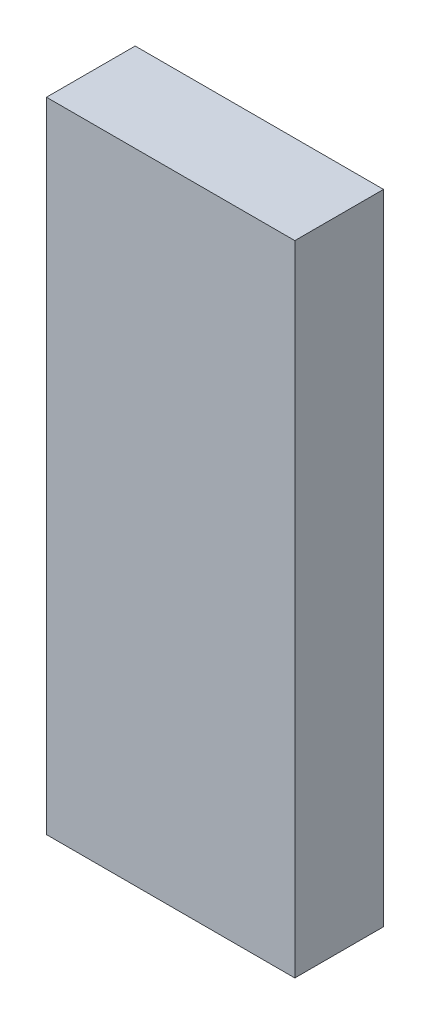
ISO-10303-21;
HEADER;
FILE_DESCRIPTION(('STEP AP214'),'2;1');
FILE_NAME('part.step','',(''),(''),'','','');
FILE_SCHEMA(('AUTOMOTIVE_DESIGN { 1 0 10303 214 1 1 1 1 }'));
ENDSEC;
DATA;
#1=APPLICATION_CONTEXT('core data for automotive mechanical design processes');
#2=APPLICATION_PROTOCOL_DEFINITION('international standard','automotive_design',2000,#1);
#3=PRODUCT_CONTEXT('',#1,'mechanical');
#4=PRODUCT('Part','Part','',(#3));
#5=PRODUCT_RELATED_PRODUCT_CATEGORY('part','',(#4));
#6=PRODUCT_DEFINITION_FORMATION('','',#4);
#7=PRODUCT_DEFINITION_CONTEXT('part definition',#1,'design');
#8=PRODUCT_DEFINITION('design','',#6,#7);
#9=PRODUCT_DEFINITION_SHAPE('','',#8);
#10=(LENGTH_UNIT() NAMED_UNIT(*) SI_UNIT(.MILLI.,.METRE.));
#11=(NAMED_UNIT(*) PLANE_ANGLE_UNIT() SI_UNIT($,.RADIAN.));
#12=(NAMED_UNIT(*) SI_UNIT($,.STERADIAN.) SOLID_ANGLE_UNIT());
#13=UNCERTAINTY_MEASURE_WITH_UNIT(LENGTH_MEASURE(1.E-05),#10,'distance_accuracy_value','');
#14=(GEOMETRIC_REPRESENTATION_CONTEXT(3) GLOBAL_UNCERTAINTY_ASSIGNED_CONTEXT((#13)) GLOBAL_UNIT_ASSIGNED_CONTEXT((#10,
#11,#12)) REPRESENTATION_CONTEXT('',''));
#15=CARTESIAN_POINT('',(0.,0.,0.));
#16=DIRECTION('',(0.,0.,1.));
#17=DIRECTION('',(1.,0.,0.));
#18=AXIS2_PLACEMENT_3D('',#15,#16,#17);
#19=CARTESIAN_POINT('',(3720.,500.,25.));
#20=DIRECTION('',(0.,1.,0.));
#21=DIRECTION('',(0.,0.,1.));
#22=AXIS2_PLACEMENT_3D('',#19,#20,#21);
#23=PLANE('',#22);
#24=DIRECTION('',(1.,0.,0.));
#25=VECTOR('',#24,1.);
#26=CARTESIAN_POINT('',(3720.,500.,0.));
#27=LINE('',#26,#25);
#28=CARTESIAN_POINT('',(3650.,500.,0.));
#29=VERTEX_POINT('',#28);
#30=CARTESIAN_POINT('',(3720.,500.,0.));
#31=VERTEX_POINT('',#30);
#32=EDGE_CURVE('E105',#29,#31,#27,.T.);
#33=ORIENTED_EDGE('',*,*,#32,.T.);
#34=DIRECTION('',(0.,0.,-1.));
#35=VECTOR('',#34,1.);
#36=CARTESIAN_POINT('',(3720.,500.,25.));
#37=LINE('',#36,#35);
#38=CARTESIAN_POINT('',(3720.,500.,25.));
#39=VERTEX_POINT('',#38);
#40=EDGE_CURVE('E11',#39,#31,#37,.T.);
#41=ORIENTED_EDGE('',*,*,#40,.F.);
#42=DIRECTION('',(1.,0.,0.));
#43=VECTOR('',#42,1.);
#44=CARTESIAN_POINT('',(3720.,500.,25.));
#45=LINE('',#44,#43);
#46=CARTESIAN_POINT('',(3650.,500.,25.));
#47=VERTEX_POINT('',#46);
#48=EDGE_CURVE('E89',#47,#39,#45,.T.);
#49=ORIENTED_EDGE('',*,*,#48,.F.);
#50=DIRECTION('',(0.,0.,-1.));
#51=VECTOR('',#50,1.);
#52=CARTESIAN_POINT('',(3650.,500.,25.));
#53=LINE('',#52,#51);
#54=EDGE_CURVE('E97',#47,#29,#53,.T.);
#55=ORIENTED_EDGE('',*,*,#54,.T.);
#56=EDGE_LOOP('',(#33,#41,#49,#55));
#57=FACE_BOUND('',#56,.T.);
#58=ADVANCED_FACE('F39',(#57),#23,.F.);
#59=CARTESIAN_POINT('',(3720.,680.,25.));
#60=DIRECTION('',(-1.,0.,0.));
#61=DIRECTION('',(0.,0.,1.));
#62=AXIS2_PLACEMENT_3D('',#59,#60,#61);
#63=PLANE('',#62);
#64=DIRECTION('',(0.,1.,0.));
#65=VECTOR('',#64,1.);
#66=CARTESIAN_POINT('',(3720.,680.,0.));
#67=LINE('',#66,#65);
#68=CARTESIAN_POINT('',(3720.,680.,0.));
#69=VERTEX_POINT('',#68);
#70=EDGE_CURVE('E92',#31,#69,#67,.T.);
#71=ORIENTED_EDGE('',*,*,#70,.T.);
#72=DIRECTION('',(0.,0.,-1.));
#73=VECTOR('',#72,1.);
#74=CARTESIAN_POINT('',(3720.,680.,25.));
#75=LINE('',#74,#73);
#76=CARTESIAN_POINT('',(3720.,680.,25.));
#77=VERTEX_POINT('',#76);
#78=EDGE_CURVE('E50',#77,#69,#75,.T.);
#79=ORIENTED_EDGE('',*,*,#78,.F.);
#80=DIRECTION('',(0.,1.,0.));
#81=VECTOR('',#80,1.);
#82=CARTESIAN_POINT('',(3720.,680.,25.));
#83=LINE('',#82,#81);
#84=EDGE_CURVE('E82',#39,#77,#83,.T.);
#85=ORIENTED_EDGE('',*,*,#84,.F.);
#86=ORIENTED_EDGE('',*,*,#40,.T.);
#87=EDGE_LOOP('',(#71,#79,#85,#86));
#88=FACE_BOUND('',#87,.T.);
#89=ADVANCED_FACE('F93',(#88),#63,.F.);
#90=CARTESIAN_POINT('',(3650.,680.,25.));
#91=DIRECTION('',(0.,-1.,0.));
#92=DIRECTION('',(0.,0.,-1.));
#93=AXIS2_PLACEMENT_3D('',#90,#91,#92);
#94=PLANE('',#93);
#95=DIRECTION('',(-1.,0.,0.));
#96=VECTOR('',#95,1.);
#97=CARTESIAN_POINT('',(3650.,680.,0.));
#98=LINE('',#97,#96);
#99=CARTESIAN_POINT('',(3650.,680.,0.));
#100=VERTEX_POINT('',#99);
#101=EDGE_CURVE('E72',#69,#100,#98,.T.);
#102=ORIENTED_EDGE('',*,*,#101,.T.);
#103=DIRECTION('',(0.,0.,-1.));
#104=VECTOR('',#103,1.);
#105=CARTESIAN_POINT('',(3650.,680.,25.));
#106=LINE('',#105,#104);
#107=CARTESIAN_POINT('',(3650.,680.,25.));
#108=VERTEX_POINT('',#107);
#109=EDGE_CURVE('E94',#108,#100,#106,.T.);
#110=ORIENTED_EDGE('',*,*,#109,.F.);
#111=DIRECTION('',(-1.,0.,0.));
#112=VECTOR('',#111,1.);
#113=CARTESIAN_POINT('',(3650.,680.,25.));
#114=LINE('',#113,#112);
#115=EDGE_CURVE('E88',#77,#108,#114,.T.);
#116=ORIENTED_EDGE('',*,*,#115,.F.);
#117=ORIENTED_EDGE('',*,*,#78,.T.);
#118=EDGE_LOOP('',(#102,#110,#116,#117));
#119=FACE_BOUND('',#118,.T.);
#120=ADVANCED_FACE('F96',(#119),#94,.F.);
#121=CARTESIAN_POINT('',(3650.,500.,25.));
#122=DIRECTION('',(1.,0.,0.));
#123=DIRECTION('',(0.,0.,-1.));
#124=AXIS2_PLACEMENT_3D('',#121,#122,#123);
#125=PLANE('',#124);
#126=DIRECTION('',(0.,-1.,0.));
#127=VECTOR('',#126,1.);
#128=CARTESIAN_POINT('',(3650.,500.,0.));
#129=LINE('',#128,#127);
#130=EDGE_CURVE('E76',#100,#29,#129,.T.);
#131=ORIENTED_EDGE('',*,*,#130,.T.);
#132=ORIENTED_EDGE('',*,*,#54,.F.);
#133=DIRECTION('',(0.,-1.,0.));
#134=VECTOR('',#133,1.);
#135=CARTESIAN_POINT('',(3650.,500.,25.));
#136=LINE('',#135,#134);
#137=EDGE_CURVE('E54',#108,#47,#136,.T.);
#138=ORIENTED_EDGE('',*,*,#137,.F.);
#139=ORIENTED_EDGE('',*,*,#109,.T.);
#140=EDGE_LOOP('',(#131,#132,#138,#139));
#141=FACE_BOUND('',#140,.T.);
#142=ADVANCED_FACE('F108',(#141),#125,.F.);
#143=CARTESIAN_POINT('',(0.,0.,25.));
#144=DIRECTION('',(0.,0.,-1.));
#145=DIRECTION('',(-1.,0.,0.));
#146=AXIS2_PLACEMENT_3D('',#143,#144,#145);
#147=PLANE('',#146);
#148=ORIENTED_EDGE('',*,*,#48,.T.);
#149=ORIENTED_EDGE('',*,*,#84,.T.);
#150=ORIENTED_EDGE('',*,*,#115,.T.);
#151=ORIENTED_EDGE('',*,*,#137,.T.);
#152=EDGE_LOOP('',(#148,#149,#150,#151));
#153=FACE_BOUND('',#152,.T.);
#154=ADVANCED_FACE('F86',(#153),#147,.F.);
#155=CARTESIAN_POINT('',(0.,0.,0.));
#156=DIRECTION('',(0.,0.,-1.));
#157=DIRECTION('',(-1.,0.,0.));
#158=AXIS2_PLACEMENT_3D('',#155,#156,#157);
#159=PLANE('',#158);
#160=ORIENTED_EDGE('',*,*,#32,.F.);
#161=ORIENTED_EDGE('',*,*,#130,.F.);
#162=ORIENTED_EDGE('',*,*,#101,.F.);
#163=ORIENTED_EDGE('',*,*,#70,.F.);
#164=EDGE_LOOP('',(#160,#161,#162,#163));
#165=FACE_BOUND('',#164,.T.);
#166=ADVANCED_FACE('F115',(#165),#159,.T.);
#167=CLOSED_SHELL('',(#58,#89,#120,#142,#154,#166));
#168=MANIFOLD_SOLID_BREP('B2',#167);
#169=ADVANCED_BREP_SHAPE_REPRESENTATION('',(#18,#168),#14);
#170=SHAPE_DEFINITION_REPRESENTATION(#9,#169);
ENDSEC;
END-ISO-10303-21;
